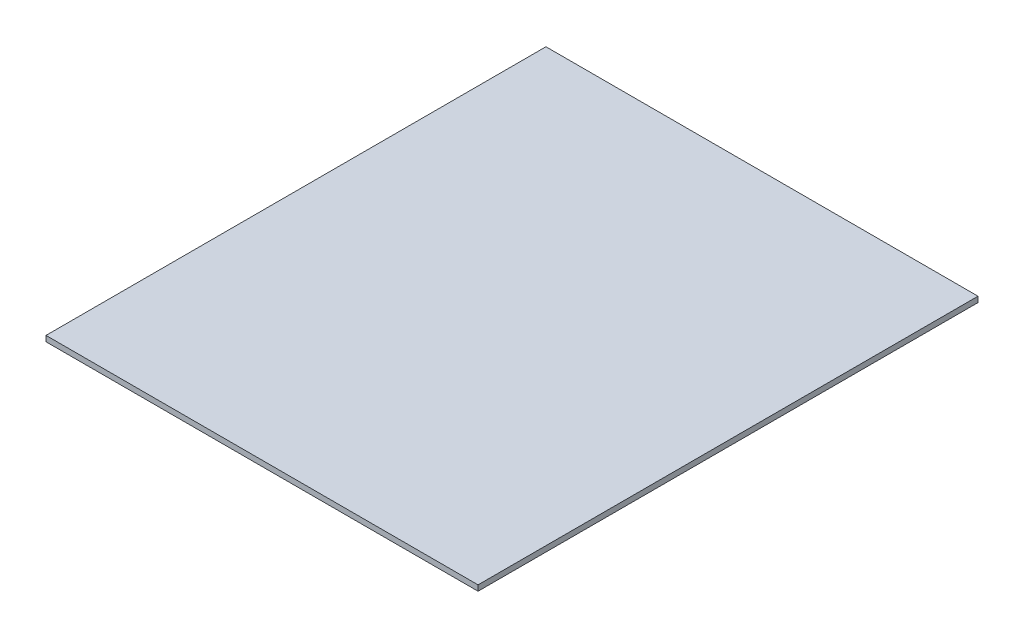
ISO-10303-21;
HEADER;
FILE_DESCRIPTION(('STEP AP214'),'2;1');
FILE_NAME('part.step','',(''),(''),'','','');
FILE_SCHEMA(('AUTOMOTIVE_DESIGN { 1 0 10303 214 1 1 1 1 }'));
ENDSEC;
DATA;
#1=APPLICATION_CONTEXT('core data for automotive mechanical design processes');
#2=APPLICATION_PROTOCOL_DEFINITION('international standard','automotive_design',2000,#1);
#3=PRODUCT_CONTEXT('',#1,'mechanical');
#4=PRODUCT('Part','Part','',(#3));
#5=PRODUCT_RELATED_PRODUCT_CATEGORY('part','',(#4));
#6=PRODUCT_DEFINITION_FORMATION('','',#4);
#7=PRODUCT_DEFINITION_CONTEXT('part definition',#1,'design');
#8=PRODUCT_DEFINITION('design','',#6,#7);
#9=PRODUCT_DEFINITION_SHAPE('','',#8);
#10=(LENGTH_UNIT() NAMED_UNIT(*) SI_UNIT(.MILLI.,.METRE.));
#11=(NAMED_UNIT(*) PLANE_ANGLE_UNIT() SI_UNIT($,.RADIAN.));
#12=(NAMED_UNIT(*) SI_UNIT($,.STERADIAN.) SOLID_ANGLE_UNIT());
#13=UNCERTAINTY_MEASURE_WITH_UNIT(LENGTH_MEASURE(1.E-05),#10,'distance_accuracy_value','');
#14=(GEOMETRIC_REPRESENTATION_CONTEXT(3) GLOBAL_UNCERTAINTY_ASSIGNED_CONTEXT((#13)) GLOBAL_UNIT_ASSIGNED_CONTEXT((#10,
#11,#12)) REPRESENTATION_CONTEXT('',''));
#15=CARTESIAN_POINT('',(0.,0.,0.));
#16=DIRECTION('',(0.,0.,1.));
#17=DIRECTION('',(1.,0.,0.));
#18=AXIS2_PLACEMENT_3D('',#15,#16,#17);
#19=CARTESIAN_POINT('',(0.,0.,0.));
#20=DIRECTION('',(0.,-1.,0.));
#21=DIRECTION('',(0.,0.,-1.));
#22=AXIS2_PLACEMENT_3D('',#19,#20,#21);
#23=PLANE('',#22);
#24=DIRECTION('',(0.,0.,-1.));
#25=VECTOR('',#24,1.);
#26=CARTESIAN_POINT('',(-17.5,0.,20.25));
#27=LINE('',#26,#25);
#28=CARTESIAN_POINT('',(-17.5,0.,20.25));
#29=VERTEX_POINT('',#28);
#30=CARTESIAN_POINT('',(-17.5,0.,-20.25));
#31=VERTEX_POINT('',#30);
#32=EDGE_CURVE('E55',#29,#31,#27,.T.);
#33=ORIENTED_EDGE('',*,*,#32,.T.);
#34=DIRECTION('',(1.,0.,0.));
#35=VECTOR('',#34,1.);
#36=CARTESIAN_POINT('',(-17.5,0.,-20.25));
#37=LINE('',#36,#35);
#38=CARTESIAN_POINT('',(17.5,0.,-20.25));
#39=VERTEX_POINT('',#38);
#40=EDGE_CURVE('E76',#31,#39,#37,.T.);
#41=ORIENTED_EDGE('',*,*,#40,.T.);
#42=DIRECTION('',(0.,0.,1.));
#43=VECTOR('',#42,1.);
#44=CARTESIAN_POINT('',(17.5,0.,20.25));
#45=LINE('',#44,#43);
#46=CARTESIAN_POINT('',(17.5,0.,20.25));
#47=VERTEX_POINT('',#46);
#48=EDGE_CURVE('E58',#39,#47,#45,.T.);
#49=ORIENTED_EDGE('',*,*,#48,.T.);
#50=DIRECTION('',(-1.,0.,0.));
#51=VECTOR('',#50,1.);
#52=CARTESIAN_POINT('',(-17.5,0.,20.25));
#53=LINE('',#52,#51);
#54=EDGE_CURVE('E20',#47,#29,#53,.T.);
#55=ORIENTED_EDGE('',*,*,#54,.T.);
#56=EDGE_LOOP('',(#33,#41,#49,#55));
#57=FACE_BOUND('',#56,.T.);
#58=ADVANCED_FACE('F17',(#57),#23,.T.);
#59=CARTESIAN_POINT('',(-17.5,0.45,20.25));
#60=DIRECTION('',(0.,0.,-1.));
#61=DIRECTION('',(-1.,0.,0.));
#62=AXIS2_PLACEMENT_3D('',#59,#60,#61);
#63=PLANE('',#62);
#64=DIRECTION('',(0.,1.,0.));
#65=VECTOR('',#64,1.);
#66=CARTESIAN_POINT('',(17.5,0.45,20.25));
#67=LINE('',#66,#65);
#68=CARTESIAN_POINT('',(17.5,0.45,20.25));
#69=VERTEX_POINT('',#68);
#70=EDGE_CURVE('E78',#47,#69,#67,.T.);
#71=ORIENTED_EDGE('',*,*,#70,.T.);
#72=DIRECTION('',(1.,0.,0.));
#73=VECTOR('',#72,1.);
#74=CARTESIAN_POINT('',(0.,0.45,20.25));
#75=LINE('',#74,#73);
#76=CARTESIAN_POINT('',(-17.5,0.45,20.25));
#77=VERTEX_POINT('',#76);
#78=EDGE_CURVE('E73',#69,#77,#75,.F.);
#79=ORIENTED_EDGE('',*,*,#78,.T.);
#80=DIRECTION('',(0.,1.,0.));
#81=VECTOR('',#80,1.);
#82=CARTESIAN_POINT('',(-17.5,0.45,20.25));
#83=LINE('',#82,#81);
#84=EDGE_CURVE('E63',#77,#29,#83,.F.);
#85=ORIENTED_EDGE('',*,*,#84,.T.);
#86=ORIENTED_EDGE('',*,*,#54,.F.);
#87=EDGE_LOOP('',(#71,#79,#85,#86));
#88=FACE_BOUND('',#87,.T.);
#89=ADVANCED_FACE('F72',(#88),#63,.F.);
#90=CARTESIAN_POINT('',(-17.5,0.45,20.25));
#91=DIRECTION('',(1.,0.,0.));
#92=DIRECTION('',(0.,0.,-1.));
#93=AXIS2_PLACEMENT_3D('',#90,#91,#92);
#94=PLANE('',#93);
#95=ORIENTED_EDGE('',*,*,#84,.F.);
#96=DIRECTION('',(0.,0.,-1.));
#97=VECTOR('',#96,1.);
#98=CARTESIAN_POINT('',(-17.5,0.45,0.));
#99=LINE('',#98,#97);
#100=CARTESIAN_POINT('',(-17.5,0.45,-20.25));
#101=VERTEX_POINT('',#100);
#102=EDGE_CURVE('E83',#77,#101,#99,.T.);
#103=ORIENTED_EDGE('',*,*,#102,.T.);
#104=DIRECTION('',(0.,1.,0.));
#105=VECTOR('',#104,1.);
#106=CARTESIAN_POINT('',(-17.5,0.45,-20.25));
#107=LINE('',#106,#105);
#108=EDGE_CURVE('E69',#101,#31,#107,.F.);
#109=ORIENTED_EDGE('',*,*,#108,.T.);
#110=ORIENTED_EDGE('',*,*,#32,.F.);
#111=EDGE_LOOP('',(#95,#103,#109,#110));
#112=FACE_BOUND('',#111,.T.);
#113=ADVANCED_FACE('F66',(#112),#94,.F.);
#114=CARTESIAN_POINT('',(-17.5,0.45,-20.25));
#115=DIRECTION('',(0.,0.,1.));
#116=DIRECTION('',(1.,0.,0.));
#117=AXIS2_PLACEMENT_3D('',#114,#115,#116);
#118=PLANE('',#117);
#119=ORIENTED_EDGE('',*,*,#108,.F.);
#120=DIRECTION('',(1.,0.,0.));
#121=VECTOR('',#120,1.);
#122=CARTESIAN_POINT('',(0.,0.45,-20.25));
#123=LINE('',#122,#121);
#124=CARTESIAN_POINT('',(17.5,0.45,-20.25));
#125=VERTEX_POINT('',#124);
#126=EDGE_CURVE('E26',#101,#125,#123,.T.);
#127=ORIENTED_EDGE('',*,*,#126,.T.);
#128=DIRECTION('',(0.,1.,0.));
#129=VECTOR('',#128,1.);
#130=CARTESIAN_POINT('',(17.5,0.45,-20.25));
#131=LINE('',#130,#129);
#132=EDGE_CURVE('E34',#125,#39,#131,.F.);
#133=ORIENTED_EDGE('',*,*,#132,.T.);
#134=ORIENTED_EDGE('',*,*,#40,.F.);
#135=EDGE_LOOP('',(#119,#127,#133,#134));
#136=FACE_BOUND('',#135,.T.);
#137=ADVANCED_FACE('F88',(#136),#118,.F.);
#138=CARTESIAN_POINT('',(17.5,0.45,20.25));
#139=DIRECTION('',(-1.,0.,0.));
#140=DIRECTION('',(0.,0.,1.));
#141=AXIS2_PLACEMENT_3D('',#138,#139,#140);
#142=PLANE('',#141);
#143=ORIENTED_EDGE('',*,*,#132,.F.);
#144=DIRECTION('',(0.,0.,-1.));
#145=VECTOR('',#144,1.);
#146=CARTESIAN_POINT('',(17.5,0.45,0.));
#147=LINE('',#146,#145);
#148=EDGE_CURVE('E11',#125,#69,#147,.F.);
#149=ORIENTED_EDGE('',*,*,#148,.T.);
#150=ORIENTED_EDGE('',*,*,#70,.F.);
#151=ORIENTED_EDGE('',*,*,#48,.F.);
#152=EDGE_LOOP('',(#143,#149,#150,#151));
#153=FACE_BOUND('',#152,.T.);
#154=ADVANCED_FACE('F91',(#153),#142,.F.);
#155=CARTESIAN_POINT('',(0.,0.45,0.));
#156=DIRECTION('',(0.,-1.,0.));
#157=DIRECTION('',(0.,0.,-1.));
#158=AXIS2_PLACEMENT_3D('',#155,#156,#157);
#159=PLANE('',#158);
#160=ORIENTED_EDGE('',*,*,#126,.F.);
#161=ORIENTED_EDGE('',*,*,#102,.F.);
#162=ORIENTED_EDGE('',*,*,#78,.F.);
#163=ORIENTED_EDGE('',*,*,#148,.F.);
#164=EDGE_LOOP('',(#160,#161,#162,#163));
#165=FACE_BOUND('',#164,.T.);
#166=ADVANCED_FACE('F90',(#165),#159,.F.);
#167=CLOSED_SHELL('',(#58,#89,#113,#137,#154,#166));
#168=MANIFOLD_SOLID_BREP('B1',#167);
#169=ADVANCED_BREP_SHAPE_REPRESENTATION('',(#18,#168),#14);
#170=SHAPE_DEFINITION_REPRESENTATION(#9,#169);
ENDSEC;
END-ISO-10303-21;
